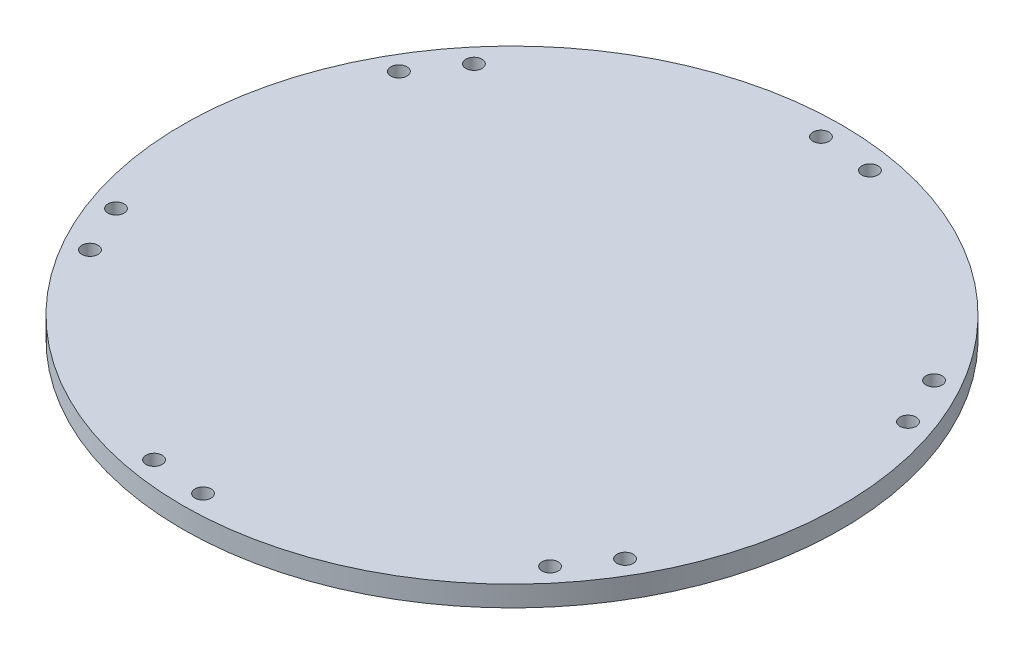
ISO-10303-21;
HEADER;
FILE_DESCRIPTION(('STEP AP214'),'2;1');
FILE_NAME('part.step','',(''),(''),'','','');
FILE_SCHEMA(('AUTOMOTIVE_DESIGN { 1 0 10303 214 1 1 1 1 }'));
ENDSEC;
DATA;
#1=APPLICATION_CONTEXT('core data for automotive mechanical design processes');
#2=APPLICATION_PROTOCOL_DEFINITION('international standard','automotive_design',2000,#1);
#3=PRODUCT_CONTEXT('',#1,'mechanical');
#4=PRODUCT('Part','Part','',(#3));
#5=PRODUCT_RELATED_PRODUCT_CATEGORY('part','',(#4));
#6=PRODUCT_DEFINITION_FORMATION('','',#4);
#7=PRODUCT_DEFINITION_CONTEXT('part definition',#1,'design');
#8=PRODUCT_DEFINITION('design','',#6,#7);
#9=PRODUCT_DEFINITION_SHAPE('','',#8);
#10=(LENGTH_UNIT() NAMED_UNIT(*) SI_UNIT(.MILLI.,.METRE.));
#11=(NAMED_UNIT(*) PLANE_ANGLE_UNIT() SI_UNIT($,.RADIAN.));
#12=(NAMED_UNIT(*) SI_UNIT($,.STERADIAN.) SOLID_ANGLE_UNIT());
#13=UNCERTAINTY_MEASURE_WITH_UNIT(LENGTH_MEASURE(1.E-05),#10,'distance_accuracy_value','');
#14=(GEOMETRIC_REPRESENTATION_CONTEXT(3) GLOBAL_UNCERTAINTY_ASSIGNED_CONTEXT((#13)) GLOBAL_UNIT_ASSIGNED_CONTEXT((#10,
#11,#12)) REPRESENTATION_CONTEXT('',''));
#15=CARTESIAN_POINT('',(0.,0.,0.));
#16=DIRECTION('',(0.,0.,1.));
#17=DIRECTION('',(1.,0.,0.));
#18=AXIS2_PLACEMENT_3D('',#15,#16,#17);
#19=CARTESIAN_POINT('',(0.,-6.35,0.));
#20=DIRECTION('',(0.,1.,0.));
#21=DIRECTION('',(0.,0.,1.));
#22=AXIS2_PLACEMENT_3D('',#19,#20,#21);
#23=CYLINDRICAL_SURFACE('',#22,101.6);
#24=CARTESIAN_POINT('',(0.,-6.35,0.));
#25=DIRECTION('',(0.,1.,0.));
#26=DIRECTION('',(0.,0.,1.));
#27=AXIS2_PLACEMENT_3D('',#24,#25,#26);
#28=CIRCLE('',#27,101.6);
#29=CARTESIAN_POINT('',(0.,-6.35,101.6));
#30=VERTEX_POINT('',#29);
#31=EDGE_CURVE('E10',#30,#30,#28,.T.);
#32=ORIENTED_EDGE('',*,*,#31,.T.);
#33=EDGE_LOOP('',(#32));
#34=FACE_BOUND('',#33,.T.);
#35=CARTESIAN_POINT('',(0.,0.,0.));
#36=DIRECTION('',(0.,1.,0.));
#37=DIRECTION('',(0.,0.,1.));
#38=AXIS2_PLACEMENT_3D('',#35,#36,#37);
#39=CIRCLE('',#38,101.6);
#40=CARTESIAN_POINT('',(0.,0.,101.6));
#41=VERTEX_POINT('',#40);
#42=EDGE_CURVE('E40',#41,#41,#39,.T.);
#43=ORIENTED_EDGE('',*,*,#42,.F.);
#44=EDGE_LOOP('',(#43));
#45=FACE_BOUND('',#44,.T.);
#46=ADVANCED_FACE('F37',(#34,#45),#23,.T.);
#47=CARTESIAN_POINT('',(0.,-6.35,0.));
#48=DIRECTION('',(0.,1.,0.));
#49=DIRECTION('',(0.,0.,1.));
#50=AXIS2_PLACEMENT_3D('',#47,#48,#49);
#51=PLANE('',#50);
#52=CARTESIAN_POINT('',(0.,-6.35,0.));
#53=DIRECTION('',(0.,-1.,0.));
#54=DIRECTION('',(0.,0.,-1.));
#55=AXIS2_PLACEMENT_3D('',#52,#53,#54);
#56=CIRCLE('',#55,25.4);
#57=CARTESIAN_POINT('',(0.,-6.35,-25.4));
#58=VERTEX_POINT('',#57);
#59=EDGE_CURVE('E147',#58,#58,#56,.T.);
#60=ORIENTED_EDGE('',*,*,#59,.F.);
#61=EDGE_LOOP('',(#60));
#62=FACE_BOUND('',#61,.T.);
#63=CARTESIAN_POINT('',(0.,-6.35,-95.25));
#64=DIRECTION('',(0.,1.,0.));
#65=DIRECTION('',(0.,0.,1.));
#66=AXIS2_PLACEMENT_3D('',#63,#64,#65);
#67=CIRCLE('',#66,2.4892);
#68=CARTESIAN_POINT('',(0.,-6.35,-92.7608));
#69=VERTEX_POINT('',#68);
#70=EDGE_CURVE('E138',#69,#69,#67,.T.);
#71=ORIENTED_EDGE('',*,*,#70,.T.);
#72=EDGE_LOOP('',(#71));
#73=FACE_BOUND('',#72,.T.);
#74=CARTESIAN_POINT('',(82.4889197104721,-6.35,-47.6250000000051));
#75=DIRECTION('',(0.,1.,0.));
#76=DIRECTION('',(0.,0.,1.));
#77=AXIS2_PLACEMENT_3D('',#74,#75,#76);
#78=CIRCLE('',#77,2.4892);
#79=CARTESIAN_POINT('',(82.4889197104721,-6.35,-45.1358000000051));
#80=VERTEX_POINT('',#79);
#81=EDGE_CURVE('E130',#80,#80,#78,.T.);
#82=ORIENTED_EDGE('',*,*,#81,.T.);
#83=EDGE_LOOP('',(#82));
#84=FACE_BOUND('',#83,.T.);
#85=CARTESIAN_POINT('',(82.4889197104788,-6.35,47.624999999996));
#86=DIRECTION('',(0.,1.,0.));
#87=DIRECTION('',(0.,0.,1.));
#88=AXIS2_PLACEMENT_3D('',#85,#86,#87);
#89=CIRCLE('',#88,2.4892);
#90=CARTESIAN_POINT('',(82.4889197104788,-6.35,50.114199999996));
#91=VERTEX_POINT('',#90);
#92=EDGE_CURVE('E122',#91,#91,#89,.T.);
#93=ORIENTED_EDGE('',*,*,#92,.T.);
#94=EDGE_LOOP('',(#93));
#95=FACE_BOUND('',#94,.T.);
#96=CARTESIAN_POINT('',(1.32371965416091E-11,-6.35,95.2500000000024));
#97=DIRECTION('',(0.,1.,0.));
#98=DIRECTION('',(0.,0.,1.));
#99=AXIS2_PLACEMENT_3D('',#96,#97,#98);
#100=CIRCLE('',#99,2.4892);
#101=CARTESIAN_POINT('',(1.32371965416091E-11,-6.35,97.7392000000024));
#102=VERTEX_POINT('',#101);
#103=EDGE_CURVE('E114',#102,#102,#100,.T.);
#104=ORIENTED_EDGE('',*,*,#103,.T.);
#105=EDGE_LOOP('',(#104));
#106=FACE_BOUND('',#105,.T.);
#107=CARTESIAN_POINT('',(-82.4889197104589,-6.35,47.6250000000076));
#108=DIRECTION('',(0.,1.,0.));
#109=DIRECTION('',(0.,0.,1.));
#110=AXIS2_PLACEMENT_3D('',#107,#108,#109);
#111=CIRCLE('',#110,2.4892);
#112=CARTESIAN_POINT('',(-82.4889197104589,-6.35,50.1142000000076));
#113=VERTEX_POINT('',#112);
#114=EDGE_CURVE('E106',#113,#113,#111,.T.);
#115=ORIENTED_EDGE('',*,*,#114,.T.);
#116=EDGE_LOOP('',(#115));
#117=FACE_BOUND('',#116,.T.);
#118=CARTESIAN_POINT('',(-82.4889197104655,-6.35,-47.6249999999937));
#119=DIRECTION('',(0.,1.,0.));
#120=DIRECTION('',(0.,0.,1.));
#121=AXIS2_PLACEMENT_3D('',#118,#119,#120);
#122=CIRCLE('',#121,2.4892);
#123=CARTESIAN_POINT('',(-82.4889197104655,-6.35,-45.1357999999937));
#124=VERTEX_POINT('',#123);
#125=EDGE_CURVE('E98',#124,#124,#122,.T.);
#126=ORIENTED_EDGE('',*,*,#125,.T.);
#127=EDGE_LOOP('',(#126));
#128=FACE_BOUND('',#127,.T.);
#129=CARTESIAN_POINT('',(-72.9657332070804,-6.35,-61.2255198226366));
#130=DIRECTION('',(0.,1.,0.));
#131=DIRECTION('',(0.,0.,1.));
#132=AXIS2_PLACEMENT_3D('',#129,#130,#131);
#133=CIRCLE('',#132,2.4892);
#134=CARTESIAN_POINT('',(-72.9657332070804,-6.35,-58.7363198226366));
#135=VERTEX_POINT('',#134);
#136=EDGE_CURVE('E90',#135,#135,#133,.T.);
#137=ORIENTED_EDGE('',*,*,#136,.T.);
#138=EDGE_LOOP('',(#137));
#139=FACE_BOUND('',#138,.T.);
#140=CARTESIAN_POINT('',(16.5399889227752,-6.35,-93.8029384744128));
#141=DIRECTION('',(0.,1.,0.));
#142=DIRECTION('',(0.,0.,1.));
#143=AXIS2_PLACEMENT_3D('',#140,#141,#142);
#144=CIRCLE('',#143,2.4892);
#145=CARTESIAN_POINT('',(16.5399889227752,-6.35,-91.3137384744128));
#146=VERTEX_POINT('',#145);
#147=EDGE_CURVE('E82',#146,#146,#144,.T.);
#148=ORIENTED_EDGE('',*,*,#147,.T.);
#149=EDGE_LOOP('',(#148));
#150=FACE_BOUND('',#149,.T.);
#151=CARTESIAN_POINT('',(89.5057221298621,-6.35,-32.5774186517751));
#152=DIRECTION('',(0.,1.,0.));
#153=DIRECTION('',(0.,0.,1.));
#154=AXIS2_PLACEMENT_3D('',#151,#152,#153);
#155=CIRCLE('',#154,2.4892);
#156=CARTESIAN_POINT('',(89.5057221298621,-6.35,-30.0882186517751));
#157=VERTEX_POINT('',#156);
#158=EDGE_CURVE('E74',#157,#157,#155,.T.);
#159=ORIENTED_EDGE('',*,*,#158,.T.);
#160=EDGE_LOOP('',(#159));
#161=FACE_BOUND('',#160,.T.);
#162=CARTESIAN_POINT('',(72.9657332070936,-6.35,61.225519822639));
#163=DIRECTION('',(0.,1.,0.));
#164=DIRECTION('',(0.,0.,1.));
#165=AXIS2_PLACEMENT_3D('',#162,#163,#164);
#166=CIRCLE('',#165,2.4892);
#167=CARTESIAN_POINT('',(72.9657332070936,-6.35,63.7147198226389));
#168=VERTEX_POINT('',#167);
#169=EDGE_CURVE('E66',#168,#168,#166,.T.);
#170=ORIENTED_EDGE('',*,*,#169,.T.);
#171=EDGE_LOOP('',(#170));
#172=FACE_BOUND('',#171,.T.);
#173=CARTESIAN_POINT('',(-16.5399889227619,-6.35,93.8029384744152));
#174=DIRECTION('',(0.,1.,0.));
#175=DIRECTION('',(0.,0.,1.));
#176=AXIS2_PLACEMENT_3D('',#173,#174,#175);
#177=CIRCLE('',#176,2.4892);
#178=CARTESIAN_POINT('',(-16.5399889227619,-6.35,96.2921384744152));
#179=VERTEX_POINT('',#178);
#180=EDGE_CURVE('E58',#179,#179,#177,.T.);
#181=ORIENTED_EDGE('',*,*,#180,.T.);
#182=EDGE_LOOP('',(#181));
#183=FACE_BOUND('',#182,.T.);
#184=CARTESIAN_POINT('',(-89.5057221298489,-6.35,32.5774186517775));
#185=DIRECTION('',(0.,1.,0.));
#186=DIRECTION('',(0.,0.,1.));
#187=AXIS2_PLACEMENT_3D('',#184,#185,#186);
#188=CIRCLE('',#187,2.4892);
#189=CARTESIAN_POINT('',(-89.5057221298489,-6.35,35.0666186517775));
#190=VERTEX_POINT('',#189);
#191=EDGE_CURVE('E49',#190,#190,#188,.T.);
#192=ORIENTED_EDGE('',*,*,#191,.T.);
#193=EDGE_LOOP('',(#192));
#194=FACE_BOUND('',#193,.T.);
#195=ORIENTED_EDGE('',*,*,#31,.F.);
#196=EDGE_LOOP('',(#195));
#197=FACE_BOUND('',#196,.T.);
#198=ADVANCED_FACE('F164',(#62,#73,#84,#95,#106,#117,#128,#139,#150,#161,#172,#183,#194,#197),
#51,.F.);
#199=CARTESIAN_POINT('',(0.,0.,0.));
#200=DIRECTION('',(0.,1.,0.));
#201=DIRECTION('',(0.,0.,1.));
#202=AXIS2_PLACEMENT_3D('',#199,#200,#201);
#203=PLANE('',#202);
#204=CARTESIAN_POINT('',(0.,0.,-95.25));
#205=DIRECTION('',(0.,1.,0.));
#206=DIRECTION('',(0.,0.,1.));
#207=AXIS2_PLACEMENT_3D('',#204,#205,#206);
#208=CIRCLE('',#207,2.4892);
#209=CARTESIAN_POINT('',(0.,0.,-92.7608));
#210=VERTEX_POINT('',#209);
#211=EDGE_CURVE('E142',#210,#210,#208,.T.);
#212=ORIENTED_EDGE('',*,*,#211,.F.);
#213=EDGE_LOOP('',(#212));
#214=FACE_BOUND('',#213,.T.);
#215=CARTESIAN_POINT('',(82.4889197104721,0.,-47.6250000000051));
#216=DIRECTION('',(0.,1.,0.));
#217=DIRECTION('',(0.,0.,1.));
#218=AXIS2_PLACEMENT_3D('',#215,#216,#217);
#219=CIRCLE('',#218,2.4892);
#220=CARTESIAN_POINT('',(82.4889197104721,0.,-45.1358000000051));
#221=VERTEX_POINT('',#220);
#222=EDGE_CURVE('E134',#221,#221,#219,.T.);
#223=ORIENTED_EDGE('',*,*,#222,.F.);
#224=EDGE_LOOP('',(#223));
#225=FACE_BOUND('',#224,.T.);
#226=CARTESIAN_POINT('',(82.4889197104788,0.,47.624999999996));
#227=DIRECTION('',(0.,1.,0.));
#228=DIRECTION('',(0.,0.,1.));
#229=AXIS2_PLACEMENT_3D('',#226,#227,#228);
#230=CIRCLE('',#229,2.4892);
#231=CARTESIAN_POINT('',(82.4889197104788,0.,50.114199999996));
#232=VERTEX_POINT('',#231);
#233=EDGE_CURVE('E126',#232,#232,#230,.T.);
#234=ORIENTED_EDGE('',*,*,#233,.F.);
#235=EDGE_LOOP('',(#234));
#236=FACE_BOUND('',#235,.T.);
#237=CARTESIAN_POINT('',(1.32371965416091E-11,0.,95.2500000000024));
#238=DIRECTION('',(0.,1.,0.));
#239=DIRECTION('',(0.,0.,1.));
#240=AXIS2_PLACEMENT_3D('',#237,#238,#239);
#241=CIRCLE('',#240,2.4892);
#242=CARTESIAN_POINT('',(1.32371965416091E-11,0.,97.7392000000024));
#243=VERTEX_POINT('',#242);
#244=EDGE_CURVE('E118',#243,#243,#241,.T.);
#245=ORIENTED_EDGE('',*,*,#244,.F.);
#246=EDGE_LOOP('',(#245));
#247=FACE_BOUND('',#246,.T.);
#248=CARTESIAN_POINT('',(-82.4889197104589,0.,47.6250000000076));
#249=DIRECTION('',(0.,1.,0.));
#250=DIRECTION('',(0.,0.,1.));
#251=AXIS2_PLACEMENT_3D('',#248,#249,#250);
#252=CIRCLE('',#251,2.4892);
#253=CARTESIAN_POINT('',(-82.4889197104589,0.,50.1142000000076));
#254=VERTEX_POINT('',#253);
#255=EDGE_CURVE('E110',#254,#254,#252,.T.);
#256=ORIENTED_EDGE('',*,*,#255,.F.);
#257=EDGE_LOOP('',(#256));
#258=FACE_BOUND('',#257,.T.);
#259=CARTESIAN_POINT('',(-82.4889197104655,0.,-47.6249999999937));
#260=DIRECTION('',(0.,1.,0.));
#261=DIRECTION('',(0.,0.,1.));
#262=AXIS2_PLACEMENT_3D('',#259,#260,#261);
#263=CIRCLE('',#262,2.4892);
#264=CARTESIAN_POINT('',(-82.4889197104655,0.,-45.1357999999937));
#265=VERTEX_POINT('',#264);
#266=EDGE_CURVE('E102',#265,#265,#263,.T.);
#267=ORIENTED_EDGE('',*,*,#266,.F.);
#268=EDGE_LOOP('',(#267));
#269=FACE_BOUND('',#268,.T.);
#270=CARTESIAN_POINT('',(-72.9657332070804,0.,-61.2255198226366));
#271=DIRECTION('',(0.,1.,0.));
#272=DIRECTION('',(0.,0.,1.));
#273=AXIS2_PLACEMENT_3D('',#270,#271,#272);
#274=CIRCLE('',#273,2.4892);
#275=CARTESIAN_POINT('',(-72.9657332070804,0.,-58.7363198226366));
#276=VERTEX_POINT('',#275);
#277=EDGE_CURVE('E94',#276,#276,#274,.T.);
#278=ORIENTED_EDGE('',*,*,#277,.F.);
#279=EDGE_LOOP('',(#278));
#280=FACE_BOUND('',#279,.T.);
#281=CARTESIAN_POINT('',(16.5399889227752,0.,-93.8029384744128));
#282=DIRECTION('',(0.,1.,0.));
#283=DIRECTION('',(0.,0.,1.));
#284=AXIS2_PLACEMENT_3D('',#281,#282,#283);
#285=CIRCLE('',#284,2.4892);
#286=CARTESIAN_POINT('',(16.5399889227752,0.,-91.3137384744128));
#287=VERTEX_POINT('',#286);
#288=EDGE_CURVE('E86',#287,#287,#285,.T.);
#289=ORIENTED_EDGE('',*,*,#288,.F.);
#290=EDGE_LOOP('',(#289));
#291=FACE_BOUND('',#290,.T.);
#292=CARTESIAN_POINT('',(89.5057221298621,0.,-32.5774186517751));
#293=DIRECTION('',(0.,1.,0.));
#294=DIRECTION('',(0.,0.,1.));
#295=AXIS2_PLACEMENT_3D('',#292,#293,#294);
#296=CIRCLE('',#295,2.4892);
#297=CARTESIAN_POINT('',(89.5057221298621,0.,-30.0882186517751));
#298=VERTEX_POINT('',#297);
#299=EDGE_CURVE('E78',#298,#298,#296,.T.);
#300=ORIENTED_EDGE('',*,*,#299,.F.);
#301=EDGE_LOOP('',(#300));
#302=FACE_BOUND('',#301,.T.);
#303=CARTESIAN_POINT('',(72.9657332070936,0.,61.225519822639));
#304=DIRECTION('',(0.,1.,0.));
#305=DIRECTION('',(0.,0.,1.));
#306=AXIS2_PLACEMENT_3D('',#303,#304,#305);
#307=CIRCLE('',#306,2.4892);
#308=CARTESIAN_POINT('',(72.9657332070936,0.,63.7147198226389));
#309=VERTEX_POINT('',#308);
#310=EDGE_CURVE('E70',#309,#309,#307,.T.);
#311=ORIENTED_EDGE('',*,*,#310,.F.);
#312=EDGE_LOOP('',(#311));
#313=FACE_BOUND('',#312,.T.);
#314=CARTESIAN_POINT('',(-16.5399889227619,0.,93.8029384744152));
#315=DIRECTION('',(0.,1.,0.));
#316=DIRECTION('',(0.,0.,1.));
#317=AXIS2_PLACEMENT_3D('',#314,#315,#316);
#318=CIRCLE('',#317,2.4892);
#319=CARTESIAN_POINT('',(-16.5399889227619,0.,96.2921384744152));
#320=VERTEX_POINT('',#319);
#321=EDGE_CURVE('E62',#320,#320,#318,.T.);
#322=ORIENTED_EDGE('',*,*,#321,.F.);
#323=EDGE_LOOP('',(#322));
#324=FACE_BOUND('',#323,.T.);
#325=CARTESIAN_POINT('',(-89.5057221298489,0.,32.5774186517775));
#326=DIRECTION('',(0.,1.,0.));
#327=DIRECTION('',(0.,0.,1.));
#328=AXIS2_PLACEMENT_3D('',#325,#326,#327);
#329=CIRCLE('',#328,2.4892);
#330=CARTESIAN_POINT('',(-89.5057221298489,0.,35.0666186517775));
#331=VERTEX_POINT('',#330);
#332=EDGE_CURVE('E54',#331,#331,#329,.T.);
#333=ORIENTED_EDGE('',*,*,#332,.F.);
#334=EDGE_LOOP('',(#333));
#335=FACE_BOUND('',#334,.T.);
#336=ORIENTED_EDGE('',*,*,#42,.T.);
#337=EDGE_LOOP('',(#336));
#338=FACE_BOUND('',#337,.T.);
#339=ADVANCED_FACE('F167',(#214,#225,#236,#247,#258,#269,#280,#291,#302,#313,#324,#335,#338),
#203,.T.);
#340=CARTESIAN_POINT('',(-89.5057221298489,0.,32.5774186517775));
#341=DIRECTION('',(0.,1.,0.));
#342=DIRECTION('',(0.,0.,1.));
#343=AXIS2_PLACEMENT_3D('',#340,#341,#342);
#344=CYLINDRICAL_SURFACE('',#343,2.4892);
#345=ORIENTED_EDGE('',*,*,#191,.F.);
#346=EDGE_LOOP('',(#345));
#347=FACE_BOUND('',#346,.T.);
#348=ORIENTED_EDGE('',*,*,#332,.T.);
#349=EDGE_LOOP('',(#348));
#350=FACE_BOUND('',#349,.T.);
#351=ADVANCED_FACE('F194',(#347,#350),#344,.F.);
#352=CARTESIAN_POINT('',(-16.5399889227619,0.,93.8029384744152));
#353=DIRECTION('',(0.,1.,0.));
#354=DIRECTION('',(0.,0.,1.));
#355=AXIS2_PLACEMENT_3D('',#352,#353,#354);
#356=CYLINDRICAL_SURFACE('',#355,2.4892);
#357=ORIENTED_EDGE('',*,*,#180,.F.);
#358=EDGE_LOOP('',(#357));
#359=FACE_BOUND('',#358,.T.);
#360=ORIENTED_EDGE('',*,*,#321,.T.);
#361=EDGE_LOOP('',(#360));
#362=FACE_BOUND('',#361,.T.);
#363=ADVANCED_FACE('F197',(#359,#362),#356,.F.);
#364=CARTESIAN_POINT('',(72.9657332070936,0.,61.225519822639));
#365=DIRECTION('',(0.,1.,0.));
#366=DIRECTION('',(0.,0.,1.));
#367=AXIS2_PLACEMENT_3D('',#364,#365,#366);
#368=CYLINDRICAL_SURFACE('',#367,2.4892);
#369=ORIENTED_EDGE('',*,*,#169,.F.);
#370=EDGE_LOOP('',(#369));
#371=FACE_BOUND('',#370,.T.);
#372=ORIENTED_EDGE('',*,*,#310,.T.);
#373=EDGE_LOOP('',(#372));
#374=FACE_BOUND('',#373,.T.);
#375=ADVANCED_FACE('F229',(#371,#374),#368,.F.);
#376=CARTESIAN_POINT('',(89.5057221298621,0.,-32.5774186517751));
#377=DIRECTION('',(0.,1.,0.));
#378=DIRECTION('',(0.,0.,1.));
#379=AXIS2_PLACEMENT_3D('',#376,#377,#378);
#380=CYLINDRICAL_SURFACE('',#379,2.4892);
#381=ORIENTED_EDGE('',*,*,#158,.F.);
#382=EDGE_LOOP('',(#381));
#383=FACE_BOUND('',#382,.T.);
#384=ORIENTED_EDGE('',*,*,#299,.T.);
#385=EDGE_LOOP('',(#384));
#386=FACE_BOUND('',#385,.T.);
#387=ADVANCED_FACE('F237',(#383,#386),#380,.F.);
#388=CARTESIAN_POINT('',(16.5399889227752,0.,-93.8029384744128));
#389=DIRECTION('',(0.,1.,0.));
#390=DIRECTION('',(0.,0.,1.));
#391=AXIS2_PLACEMENT_3D('',#388,#389,#390);
#392=CYLINDRICAL_SURFACE('',#391,2.4892);
#393=ORIENTED_EDGE('',*,*,#147,.F.);
#394=EDGE_LOOP('',(#393));
#395=FACE_BOUND('',#394,.T.);
#396=ORIENTED_EDGE('',*,*,#288,.T.);
#397=EDGE_LOOP('',(#396));
#398=FACE_BOUND('',#397,.T.);
#399=ADVANCED_FACE('F245',(#395,#398),#392,.F.);
#400=CARTESIAN_POINT('',(-72.9657332070804,0.,-61.2255198226366));
#401=DIRECTION('',(0.,1.,0.));
#402=DIRECTION('',(0.,0.,1.));
#403=AXIS2_PLACEMENT_3D('',#400,#401,#402);
#404=CYLINDRICAL_SURFACE('',#403,2.4892);
#405=ORIENTED_EDGE('',*,*,#136,.F.);
#406=EDGE_LOOP('',(#405));
#407=FACE_BOUND('',#406,.T.);
#408=ORIENTED_EDGE('',*,*,#277,.T.);
#409=EDGE_LOOP('',(#408));
#410=FACE_BOUND('',#409,.T.);
#411=ADVANCED_FACE('F253',(#407,#410),#404,.F.);
#412=CARTESIAN_POINT('',(-82.4889197104655,0.,-47.6249999999937));
#413=DIRECTION('',(0.,1.,0.));
#414=DIRECTION('',(0.,0.,1.));
#415=AXIS2_PLACEMENT_3D('',#412,#413,#414);
#416=CYLINDRICAL_SURFACE('',#415,2.4892);
#417=ORIENTED_EDGE('',*,*,#125,.F.);
#418=EDGE_LOOP('',(#417));
#419=FACE_BOUND('',#418,.T.);
#420=ORIENTED_EDGE('',*,*,#266,.T.);
#421=EDGE_LOOP('',(#420));
#422=FACE_BOUND('',#421,.T.);
#423=ADVANCED_FACE('F261',(#419,#422),#416,.F.);
#424=CARTESIAN_POINT('',(-82.4889197104589,0.,47.6250000000076));
#425=DIRECTION('',(0.,1.,0.));
#426=DIRECTION('',(0.,0.,1.));
#427=AXIS2_PLACEMENT_3D('',#424,#425,#426);
#428=CYLINDRICAL_SURFACE('',#427,2.4892);
#429=ORIENTED_EDGE('',*,*,#114,.F.);
#430=EDGE_LOOP('',(#429));
#431=FACE_BOUND('',#430,.T.);
#432=ORIENTED_EDGE('',*,*,#255,.T.);
#433=EDGE_LOOP('',(#432));
#434=FACE_BOUND('',#433,.T.);
#435=ADVANCED_FACE('F269',(#431,#434),#428,.F.);
#436=CARTESIAN_POINT('',(1.32371965416091E-11,0.,95.2500000000024));
#437=DIRECTION('',(0.,1.,0.));
#438=DIRECTION('',(0.,0.,1.));
#439=AXIS2_PLACEMENT_3D('',#436,#437,#438);
#440=CYLINDRICAL_SURFACE('',#439,2.4892);
#441=ORIENTED_EDGE('',*,*,#103,.F.);
#442=EDGE_LOOP('',(#441));
#443=FACE_BOUND('',#442,.T.);
#444=ORIENTED_EDGE('',*,*,#244,.T.);
#445=EDGE_LOOP('',(#444));
#446=FACE_BOUND('',#445,.T.);
#447=ADVANCED_FACE('F277',(#443,#446),#440,.F.);
#448=CARTESIAN_POINT('',(82.4889197104788,0.,47.624999999996));
#449=DIRECTION('',(0.,1.,0.));
#450=DIRECTION('',(0.,0.,1.));
#451=AXIS2_PLACEMENT_3D('',#448,#449,#450);
#452=CYLINDRICAL_SURFACE('',#451,2.4892);
#453=ORIENTED_EDGE('',*,*,#92,.F.);
#454=EDGE_LOOP('',(#453));
#455=FACE_BOUND('',#454,.T.);
#456=ORIENTED_EDGE('',*,*,#233,.T.);
#457=EDGE_LOOP('',(#456));
#458=FACE_BOUND('',#457,.T.);
#459=ADVANCED_FACE('F285',(#455,#458),#452,.F.);
#460=CARTESIAN_POINT('',(82.4889197104721,0.,-47.6250000000051));
#461=DIRECTION('',(0.,1.,0.));
#462=DIRECTION('',(0.,0.,1.));
#463=AXIS2_PLACEMENT_3D('',#460,#461,#462);
#464=CYLINDRICAL_SURFACE('',#463,2.4892);
#465=ORIENTED_EDGE('',*,*,#81,.F.);
#466=EDGE_LOOP('',(#465));
#467=FACE_BOUND('',#466,.T.);
#468=ORIENTED_EDGE('',*,*,#222,.T.);
#469=EDGE_LOOP('',(#468));
#470=FACE_BOUND('',#469,.T.);
#471=ADVANCED_FACE('F293',(#467,#470),#464,.F.);
#472=CARTESIAN_POINT('',(0.,0.,-95.25));
#473=DIRECTION('',(0.,1.,0.));
#474=DIRECTION('',(0.,0.,1.));
#475=AXIS2_PLACEMENT_3D('',#472,#473,#474);
#476=CYLINDRICAL_SURFACE('',#475,2.4892);
#477=ORIENTED_EDGE('',*,*,#70,.F.);
#478=EDGE_LOOP('',(#477));
#479=FACE_BOUND('',#478,.T.);
#480=ORIENTED_EDGE('',*,*,#211,.T.);
#481=EDGE_LOOP('',(#480));
#482=FACE_BOUND('',#481,.T.);
#483=ADVANCED_FACE('F160',(#479,#482),#476,.F.);
#484=CARTESIAN_POINT('',(0.,-2.54,0.));
#485=DIRECTION('',(0.,-1.,0.));
#486=DIRECTION('',(0.,0.,-1.));
#487=AXIS2_PLACEMENT_3D('',#484,#485,#486);
#488=CYLINDRICAL_SURFACE('',#487,25.4);
#489=CARTESIAN_POINT('',(0.,-2.54,0.));
#490=DIRECTION('',(0.,-1.,0.));
#491=DIRECTION('',(0.,0.,-1.));
#492=AXIS2_PLACEMENT_3D('',#489,#490,#491);
#493=CIRCLE('',#492,25.4);
#494=CARTESIAN_POINT('',(0.,-2.54,-25.4));
#495=VERTEX_POINT('',#494);
#496=EDGE_CURVE('E146',#495,#495,#493,.T.);
#497=CARTESIAN_POINT('',(0.,-2.54,-25.4));
#498=CARTESIAN_POINT('',(0.,-2.5796875,-25.4));
#499=CARTESIAN_POINT('',(0.,-2.619375,-25.4));
#500=CARTESIAN_POINT('',(0.,-2.69875,-25.4));
#501=CARTESIAN_POINT('',(0.,-2.7384375,-25.4));
#502=CARTESIAN_POINT('',(0.,-2.8178125,-25.4));
#503=CARTESIAN_POINT('',(0.,-2.8575,-25.4));
#504=CARTESIAN_POINT('',(0.,-2.936875,-25.4));
#505=CARTESIAN_POINT('',(0.,-2.9765625,-25.4));
#506=CARTESIAN_POINT('',(0.,-3.0559375,-25.4));
#507=CARTESIAN_POINT('',(0.,-3.095625,-25.4));
#508=CARTESIAN_POINT('',(0.,-3.175,-25.4));
#509=CARTESIAN_POINT('',(0.,-3.2146875,-25.4));
#510=CARTESIAN_POINT('',(0.,-3.2940625,-25.4));
#511=CARTESIAN_POINT('',(0.,-3.33375,-25.4));
#512=CARTESIAN_POINT('',(0.,-3.413125,-25.4));
#513=CARTESIAN_POINT('',(0.,-3.4528125,-25.4));
#514=CARTESIAN_POINT('',(0.,-3.5321875,-25.4));
#515=CARTESIAN_POINT('',(0.,-3.571875,-25.4));
#516=CARTESIAN_POINT('',(0.,-3.65125,-25.4));
#517=CARTESIAN_POINT('',(0.,-3.6909375,-25.4));
#518=CARTESIAN_POINT('',(0.,-3.7703125,-25.4));
#519=CARTESIAN_POINT('',(0.,-3.81,-25.4));
#520=CARTESIAN_POINT('',(0.,-3.889375,-25.4));
#521=CARTESIAN_POINT('',(0.,-3.9290625,-25.4));
#522=CARTESIAN_POINT('',(0.,-4.0084375,-25.4));
#523=CARTESIAN_POINT('',(0.,-4.048125,-25.4));
#524=CARTESIAN_POINT('',(0.,-4.1275,-25.4));
#525=CARTESIAN_POINT('',(0.,-4.1671875,-25.4));
#526=CARTESIAN_POINT('',(0.,-4.2465625,-25.4));
#527=CARTESIAN_POINT('',(0.,-4.28625,-25.4));
#528=CARTESIAN_POINT('',(0.,-4.365625,-25.4));
#529=CARTESIAN_POINT('',(0.,-4.4053125,-25.4));
#530=CARTESIAN_POINT('',(0.,-4.4846875,-25.4));
#531=CARTESIAN_POINT('',(0.,-4.524375,-25.4));
#532=CARTESIAN_POINT('',(0.,-4.60375,-25.4));
#533=CARTESIAN_POINT('',(0.,-4.6434375,-25.4));
#534=CARTESIAN_POINT('',(0.,-4.7228125,-25.4));
#535=CARTESIAN_POINT('',(0.,-4.7625,-25.4));
#536=CARTESIAN_POINT('',(0.,-4.841875,-25.4));
#537=CARTESIAN_POINT('',(0.,-4.8815625,-25.4));
#538=CARTESIAN_POINT('',(0.,-4.9609375,-25.4));
#539=CARTESIAN_POINT('',(0.,-5.000625,-25.4));
#540=CARTESIAN_POINT('',(0.,-5.08,-25.4));
#541=CARTESIAN_POINT('',(0.,-5.1196875,-25.4));
#542=CARTESIAN_POINT('',(0.,-5.1990625,-25.4));
#543=CARTESIAN_POINT('',(0.,-5.23875,-25.4));
#544=CARTESIAN_POINT('',(0.,-5.318125,-25.4));
#545=CARTESIAN_POINT('',(0.,-5.3578125,-25.4));
#546=CARTESIAN_POINT('',(0.,-5.4371875,-25.4));
#547=CARTESIAN_POINT('',(0.,-5.476875,-25.4));
#548=CARTESIAN_POINT('',(0.,-5.55625,-25.4));
#549=CARTESIAN_POINT('',(0.,-5.5959375,-25.4));
#550=CARTESIAN_POINT('',(0.,-5.6753125,-25.4));
#551=CARTESIAN_POINT('',(0.,-5.715,-25.4));
#552=CARTESIAN_POINT('',(0.,-5.794375,-25.4));
#553=CARTESIAN_POINT('',(0.,-5.8340625,-25.4));
#554=CARTESIAN_POINT('',(0.,-5.9134375,-25.4));
#555=CARTESIAN_POINT('',(0.,-5.953125,-25.4));
#556=CARTESIAN_POINT('',(0.,-6.0325,-25.4));
#557=CARTESIAN_POINT('',(0.,-6.0721875,-25.4));
#558=CARTESIAN_POINT('',(0.,-6.1515625,-25.4));
#559=CARTESIAN_POINT('',(0.,-6.19125,-25.4));
#560=CARTESIAN_POINT('',(0.,-6.270625,-25.4));
#561=CARTESIAN_POINT('',(0.,-6.3103125,-25.4));
#562=CARTESIAN_POINT('',(0.,-6.35,-25.4));
#563=B_SPLINE_CURVE_WITH_KNOTS('',3,(#497,#498,#499,#500,#501,#502,#503,#504,#505,#506,#507,
#508,#509,#510,#511,#512,#513,#514,#515,#516,#517,#518,#519,#520,#521,#522,#523,#524,#525,#526,
#527,#528,#529,#530,#531,#532,#533,#534,#535,#536,#537,#538,#539,#540,#541,#542,#543,#544,#545,
#546,#547,#548,#549,#550,#551,#552,#553,#554,#555,#556,#557,#558,#559,#560,#561,#562),
.UNSPECIFIED.,.F.,.F.,(4,2,2,2,2,2,2,2,2,2,2,2,2,2,2,2,2,2,2,2,2,2,2,2,2,2,2,2,2,2,2,2,4),(0.,
0.1190625,0.238125,0.3571875,0.47625,0.5953125,0.714375,0.8334375,0.9525,1.0715625,1.190625,
1.3096875,1.42875,1.5478125,1.666875,1.7859375,1.905,2.0240625,2.143125,2.2621875,2.38125,
2.5003125,2.619375,2.7384375,2.8575,2.9765625,3.095625,3.2146875,3.33375,3.4528125,3.571875,
3.6909375,3.81),.UNSPECIFIED.);
#564=EDGE_CURVE('BSEAM157',#495,#58,#563,.T.);
#565=ORIENTED_EDGE('',*,*,#496,.F.);
#566=ORIENTED_EDGE('',*,*,#59,.T.);
#567=ORIENTED_EDGE('',*,*,#564,.T.);
#568=ORIENTED_EDGE('',*,*,#564,.F.);
#569=EDGE_LOOP('',(#565,#567,#566,#568));
#570=FACE_BOUND('',#569,.T.);
#571=ADVANCED_FACE('F157',(#570),#488,.F.);
#572=CARTESIAN_POINT('',(0.,-2.54,0.));
#573=DIRECTION('',(0.,-1.,0.));
#574=DIRECTION('',(0.,0.,-1.));
#575=AXIS2_PLACEMENT_3D('',#572,#573,#574);
#576=PLANE('',#575);
#577=ORIENTED_EDGE('',*,*,#496,.T.);
#578=EDGE_LOOP('',(#577));
#579=FACE_BOUND('',#578,.T.);
#580=ADVANCED_FACE('F155',(#579),#576,.T.);
#581=CLOSED_SHELL('',(#46,#198,#339,#351,#363,#375,#387,#399,#411,#423,#435,#447,#459,#471,#483,
#571,#580));
#582=MANIFOLD_SOLID_BREP('B2',#581);
#583=ADVANCED_BREP_SHAPE_REPRESENTATION('',(#18,#582),#14);
#584=SHAPE_DEFINITION_REPRESENTATION(#9,#583);
ENDSEC;
END-ISO-10303-21;
